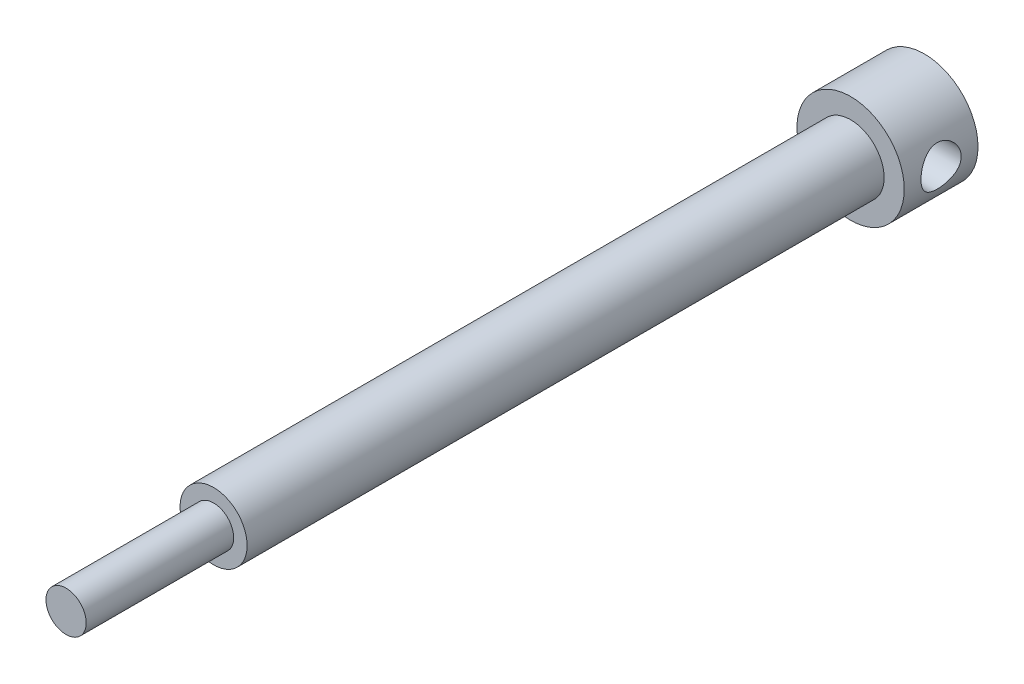
ISO-10303-21;
HEADER;
FILE_DESCRIPTION(('STEP AP214'),'2;1');
FILE_NAME('part.step','',(''),(''),'','','');
FILE_SCHEMA(('AUTOMOTIVE_DESIGN { 1 0 10303 214 1 1 1 1 }'));
ENDSEC;
DATA;
#1=APPLICATION_CONTEXT('core data for automotive mechanical design processes');
#2=APPLICATION_PROTOCOL_DEFINITION('international standard','automotive_design',2000,#1);
#3=PRODUCT_CONTEXT('',#1,'mechanical');
#4=PRODUCT('Part','Part','',(#3));
#5=PRODUCT_RELATED_PRODUCT_CATEGORY('part','',(#4));
#6=PRODUCT_DEFINITION_FORMATION('','',#4);
#7=PRODUCT_DEFINITION_CONTEXT('part definition',#1,'design');
#8=PRODUCT_DEFINITION('design','',#6,#7);
#9=PRODUCT_DEFINITION_SHAPE('','',#8);
#10=(LENGTH_UNIT() NAMED_UNIT(*) SI_UNIT(.MILLI.,.METRE.));
#11=(NAMED_UNIT(*) PLANE_ANGLE_UNIT() SI_UNIT($,.RADIAN.));
#12=(NAMED_UNIT(*) SI_UNIT($,.STERADIAN.) SOLID_ANGLE_UNIT());
#13=UNCERTAINTY_MEASURE_WITH_UNIT(LENGTH_MEASURE(1.E-05),#10,'distance_accuracy_value','');
#14=(GEOMETRIC_REPRESENTATION_CONTEXT(3) GLOBAL_UNCERTAINTY_ASSIGNED_CONTEXT((#13)) GLOBAL_UNIT_ASSIGNED_CONTEXT((#10,
#11,#12)) REPRESENTATION_CONTEXT('',''));
#15=CARTESIAN_POINT('',(0.,0.,0.));
#16=DIRECTION('',(0.,0.,1.));
#17=DIRECTION('',(1.,0.,0.));
#18=AXIS2_PLACEMENT_3D('',#15,#16,#17);
#19=CARTESIAN_POINT('',(0.,0.,11.));
#20=DIRECTION('',(0.,0.,-1.));
#21=DIRECTION('',(-1.,0.,0.));
#22=AXIS2_PLACEMENT_3D('',#19,#20,#21);
#23=CYLINDRICAL_SURFACE('',#22,8.);
#24=CARTESIAN_POINT('',(-8.,0.,2.5));
#25=CARTESIAN_POINT('',(-8.00000434912302,0.162470117875706,2.49999419539378));
#26=CARTESIAN_POINT('',(-7.99500758566368,0.324900483563584,2.51323952049677));
#27=CARTESIAN_POINT('',(-7.97557392013855,0.644906904704722,2.56565639053986));
#28=CARTESIAN_POINT('',(-7.96113837787987,0.802483655975232,2.60482420094113));
#29=CARTESIAN_POINT('',(-7.92437664783088,1.10812156998176,2.70750600354352));
#30=CARTESIAN_POINT('',(-7.90206568698877,1.25620044832455,2.77097303364358));
#31=CARTESIAN_POINT('',(-7.85177535530709,1.53959862032051,2.92021282603164));
#32=CARTESIAN_POINT('',(-7.82379446455107,1.67491447835576,3.0059915710883));
#33=CARTESIAN_POINT('',(-7.76372493942421,1.93469283409165,3.20122506214183));
#34=CARTESIAN_POINT('',(-7.73152005167087,2.05854146030237,3.31146052451884));
#35=CARTESIAN_POINT('',(-7.66720441742698,2.28648842948728,3.55082086931765));
#36=CARTESIAN_POINT('',(-7.63509370270232,2.39058072718411,3.67995151217563));
#37=CARTESIAN_POINT('',(-7.5732494123529,2.57996404431964,3.95943493504654));
#38=CARTESIAN_POINT('',(-7.5436529764098,2.66438786391496,4.1104087330921));
#39=CARTESIAN_POINT('',(-7.49199720475523,2.80637292668193,4.42569670833658));
#40=CARTESIAN_POINT('',(-7.46993485954215,2.86394489922567,4.59000552630848));
#41=CARTESIAN_POINT('',(-7.43708825645919,2.94816862035013,4.92023348051806));
#42=CARTESIAN_POINT('',(-7.42587848693063,2.97599186436803,5.08581007687695));
#43=CARTESIAN_POINT('',(-7.41476122931038,3.00359113063608,5.41963231598162));
#44=CARTESIAN_POINT('',(-7.41484907350686,3.00337873606425,5.58787682772633));
#45=CARTESIAN_POINT('',(-7.42595023233986,2.97580859218857,5.91153905045712));
#46=CARTESIAN_POINT('',(-7.43630937632964,2.95007617013711,6.0671218121852));
#47=CARTESIAN_POINT('',(-7.46569876010067,2.87488335732475,6.37157430090249));
#48=CARTESIAN_POINT('',(-7.48473030568195,2.82541939325577,6.520443013249));
#49=CARTESIAN_POINT('',(-7.52971404410467,2.70327497145115,6.81055413542651));
#50=CARTESIAN_POINT('',(-7.55579035984378,2.63017297474552,6.95159897223456));
#51=CARTESIAN_POINT('',(-7.61188420270589,2.46312147525044,7.21989147518999));
#52=CARTESIAN_POINT('',(-7.64190308912093,2.36916477457696,7.34713435504162));
#53=CARTESIAN_POINT('',(-7.70496077720597,2.15563561533201,7.59320732729938));
#54=CARTESIAN_POINT('',(-7.73806694911977,2.03476597433939,7.71089728149555));
#55=CARTESIAN_POINT('',(-7.80183456327535,1.77462518163776,7.92467593241223));
#56=CARTESIAN_POINT('',(-7.83249562931733,1.63535120699465,8.02076130921151));
#57=CARTESIAN_POINT('',(-7.88852789618334,1.33944687398492,8.18986079412487));
#58=CARTESIAN_POINT('',(-7.91380996519278,1.18258142768946,8.26249516244208));
#59=CARTESIAN_POINT('',(-7.95557436653877,0.857673701049146,8.37996520854013));
#60=CARTESIAN_POINT('',(-7.97206060682974,0.689636421691529,8.42481323312225));
#61=CARTESIAN_POINT('',(-7.99368886456142,0.356750486297336,8.48324557508387));
#62=CARTESIAN_POINT('',(-7.99938738051376,0.192207239124421,8.49836521276502));
#63=CARTESIAN_POINT('',(-8.00051787400248,-0.13714495051005,8.50138212779984));
#64=CARTESIAN_POINT('',(-7.99595212773726,-0.301953825966746,8.48928544063356));
#65=CARTESIAN_POINT('',(-7.97743419545287,-0.620524097123718,8.43937991538266));
#66=CARTESIAN_POINT('',(-7.9638494192461,-0.774466656014671,8.40257691252583));
#67=CARTESIAN_POINT('',(-7.92902954183434,-1.07388350991444,8.30562785490536));
#68=CARTESIAN_POINT('',(-7.9077934456406,-1.21935670069507,8.24547876410393));
#69=CARTESIAN_POINT('',(-7.85899248815363,-1.50249553022031,8.10162717512105));
#70=CARTESIAN_POINT('',(-7.83126000418696,-1.63980616711559,8.01728454155323));
#71=CARTESIAN_POINT('',(-7.77253343129328,-1.89878542345325,7.82816379365689));
#72=CARTESIAN_POINT('',(-7.74153814019032,-2.0204482405409,7.7233781349097));
#73=CARTESIAN_POINT('',(-7.67746658981979,-2.25206159748908,7.48919175575145));
#74=CARTESIAN_POINT('',(-7.64437393007459,-2.36092308247137,7.3587156344546));
#75=CARTESIAN_POINT('',(-7.58157631493707,-2.55542100063806,7.08069723058469));
#76=CARTESIAN_POINT('',(-7.55187166388799,-2.64105534829037,6.933153417223));
#77=CARTESIAN_POINT('',(-7.49933659644927,-2.78675547037995,6.62396802645537));
#78=CARTESIAN_POINT('',(-7.47653520656987,-2.84671370893836,6.46227050817913));
#79=CARTESIAN_POINT('',(-7.4410806578201,-2.93815766933778,6.12998047262436));
#80=CARTESIAN_POINT('',(-7.42842122114981,-2.9696610061107,5.95939352760375));
#81=CARTESIAN_POINT('',(-7.41551789585147,-3.00172694195678,5.62596768091777));
#82=CARTESIAN_POINT('',(-7.41452889046682,-3.00414662991675,5.46333473656623));
#83=CARTESIAN_POINT('',(-7.42316825490584,-2.98273431283185,5.14010936744767));
#84=CARTESIAN_POINT('',(-7.43279561797798,-2.95890479700247,4.97951675065683));
#85=CARTESIAN_POINT('',(-7.46096283170865,-2.88711631260483,4.6699055465669));
#86=CARTESIAN_POINT('',(-7.47922170753326,-2.83991596633048,4.52068330750931));
#87=CARTESIAN_POINT('',(-7.52243096595689,-2.72339393559839,4.23218898301116));
#88=CARTESIAN_POINT('',(-7.54738303990429,-2.65406665889889,4.09291942385972));
#89=CARTESIAN_POINT('',(-7.60279447807929,-2.49104151876308,3.82034642060474));
#90=CARTESIAN_POINT('',(-7.63347396881928,-2.3962566560602,3.68773840640018));
#91=CARTESIAN_POINT('',(-7.69612493514355,-2.18668971459812,3.43971687805759));
#92=CARTESIAN_POINT('',(-7.7280968188629,-2.07190128025617,3.3243088504265));
#93=CARTESIAN_POINT('',(-7.79180849219762,-1.81816079356925,3.10759608835632));
#94=CARTESIAN_POINT('',(-7.82344209801289,-1.67823728842599,3.00739249313065));
#95=CARTESIAN_POINT('',(-7.88109028914061,-1.38242644640164,2.83195468944689));
#96=CARTESIAN_POINT('',(-7.90710443703118,-1.22653786818124,2.75672242452726));
#97=CARTESIAN_POINT('',(-7.9514858521336,-0.895998164004625,2.63124634190334));
#98=CARTESIAN_POINT('',(-7.96947314316712,-0.720826844468417,2.58222587079621));
#99=CARTESIAN_POINT('',(-7.99372484359173,-0.363751467212764,2.51661408015864));
#100=CARTESIAN_POINT('',(-7.99999513207934,-0.181850832729718,2.50000649702535));
#101=CARTESIAN_POINT('',(-8.,0.,2.5));
#102=B_SPLINE_CURVE_WITH_KNOTS('',3,(#24,#25,#26,#27,#28,#29,#30,#31,#32,#33,#34,#35,#36,#37,
#38,#39,#40,#41,#42,#43,#44,#45,#46,#47,#48,#49,#50,#51,#52,#53,#54,#55,#56,#57,#58,#59,#60,#61,
#62,#63,#64,#65,#66,#67,#68,#69,#70,#71,#72,#73,#74,#75,#76,#77,#78,#79,#80,#81,#82,#83,#84,#85,
#86,#87,#88,#89,#90,#91,#92,#93,#94,#95,#96,#97,#98,#99,#100,#101),.UNSPECIFIED.,.T.,.F.,(4,2,2,
2,2,2,2,2,2,2,2,2,2,2,2,2,2,2,2,2,2,2,2,2,2,2,2,2,2,2,2,2,2,2,2,2,2,2,4),(0.,0.48673960312112,
0.973409099060921,1.45914273842715,1.94500675921898,2.44947237165431,2.95409209851243,
3.47793349003317,4.00156538704268,4.50371748833803,5.00566212159414,5.47756690242935,
5.94954276126852,6.43044816779711,6.91151981494191,7.42492306677299,7.93840515815806,
8.45982750577824,8.98101799403365,9.47450039277525,9.96787336786715,10.4422887585335,
10.9167658651458,11.4051844372487,11.8937836004541,12.4107303891699,12.9277235784596,
13.4468613346008,13.9656774991869,14.4511752696618,14.9366270042819,15.4072628485874,
15.8780177331869,16.3734494377422,16.869038839998,17.3914465931375,17.9138949961588,
18.4589703006976,19.0037720359793),.UNSPECIFIED.);
#103=CARTESIAN_POINT('',(-8.,0.,2.5));
#104=VERTEX_POINT('',#103);
#105=EDGE_CURVE('E10',#104,#104,#102,.T.);
#106=ORIENTED_EDGE('',*,*,#105,.T.);
#107=EDGE_LOOP('',(#106));
#108=FACE_BOUND('',#107,.T.);
#109=CARTESIAN_POINT('',(8.,0.,2.5));
#110=CARTESIAN_POINT('',(8.00000434912302,-0.162470117875706,2.49999419539378));
#111=CARTESIAN_POINT('',(7.99500758566368,-0.324900483563584,2.51323952049677));
#112=CARTESIAN_POINT('',(7.97557392013855,-0.644906904704722,2.56565639053986));
#113=CARTESIAN_POINT('',(7.96113837787987,-0.802483655975232,2.60482420094113));
#114=CARTESIAN_POINT('',(7.92437664783088,-1.10812156998176,2.70750600354352));
#115=CARTESIAN_POINT('',(7.90206568698877,-1.25620044832455,2.77097303364358));
#116=CARTESIAN_POINT('',(7.85177535530709,-1.53959862032051,2.92021282603164));
#117=CARTESIAN_POINT('',(7.82379446455107,-1.67491447835576,3.0059915710883));
#118=CARTESIAN_POINT('',(7.76372493942421,-1.93469283409165,3.20122506214183));
#119=CARTESIAN_POINT('',(7.73152005167087,-2.05854146030237,3.31146052451884));
#120=CARTESIAN_POINT('',(7.66720441742698,-2.28648842948728,3.55082086931765));
#121=CARTESIAN_POINT('',(7.63509370270232,-2.39058072718411,3.67995151217563));
#122=CARTESIAN_POINT('',(7.5732494123529,-2.57996404431964,3.95943493504654));
#123=CARTESIAN_POINT('',(7.5436529764098,-2.66438786391496,4.1104087330921));
#124=CARTESIAN_POINT('',(7.49199720475523,-2.80637292668193,4.42569670833658));
#125=CARTESIAN_POINT('',(7.46993485954215,-2.86394489922567,4.59000552630848));
#126=CARTESIAN_POINT('',(7.43708825645919,-2.94816862035013,4.92023348051806));
#127=CARTESIAN_POINT('',(7.42587848693063,-2.97599186436803,5.08581007687695));
#128=CARTESIAN_POINT('',(7.41476122931038,-3.00359113063608,5.41963231598162));
#129=CARTESIAN_POINT('',(7.41484907350686,-3.00337873606425,5.58787682772633));
#130=CARTESIAN_POINT('',(7.42595023233986,-2.97580859218857,5.91153905045712));
#131=CARTESIAN_POINT('',(7.43630937632964,-2.95007617013711,6.0671218121852));
#132=CARTESIAN_POINT('',(7.46569876010067,-2.87488335732475,6.37157430090249));
#133=CARTESIAN_POINT('',(7.48473030568195,-2.82541939325577,6.520443013249));
#134=CARTESIAN_POINT('',(7.52971404410467,-2.70327497145115,6.81055413542651));
#135=CARTESIAN_POINT('',(7.55579035984378,-2.63017297474552,6.95159897223456));
#136=CARTESIAN_POINT('',(7.61188420270589,-2.46312147525044,7.21989147518999));
#137=CARTESIAN_POINT('',(7.64190308912093,-2.36916477457696,7.34713435504162));
#138=CARTESIAN_POINT('',(7.70496077720597,-2.15563561533201,7.59320732729938));
#139=CARTESIAN_POINT('',(7.73806694911977,-2.03476597433939,7.71089728149555));
#140=CARTESIAN_POINT('',(7.80183456327535,-1.77462518163776,7.92467593241223));
#141=CARTESIAN_POINT('',(7.83249562931733,-1.63535120699465,8.02076130921151));
#142=CARTESIAN_POINT('',(7.88852789618334,-1.33944687398492,8.18986079412487));
#143=CARTESIAN_POINT('',(7.91380996519278,-1.18258142768946,8.26249516244208));
#144=CARTESIAN_POINT('',(7.95557436653877,-0.857673701049146,8.37996520854013));
#145=CARTESIAN_POINT('',(7.97206060682974,-0.689636421691529,8.42481323312225));
#146=CARTESIAN_POINT('',(7.99368886456142,-0.356750486297336,8.48324557508387));
#147=CARTESIAN_POINT('',(7.99938738051376,-0.192207239124421,8.49836521276502));
#148=CARTESIAN_POINT('',(8.00051787400248,0.13714495051005,8.50138212779984));
#149=CARTESIAN_POINT('',(7.99595212773726,0.301953825966746,8.48928544063356));
#150=CARTESIAN_POINT('',(7.97743419545287,0.620524097123718,8.43937991538266));
#151=CARTESIAN_POINT('',(7.9638494192461,0.774466656014671,8.40257691252583));
#152=CARTESIAN_POINT('',(7.92902954183434,1.07388350991444,8.30562785490536));
#153=CARTESIAN_POINT('',(7.9077934456406,1.21935670069507,8.24547876410393));
#154=CARTESIAN_POINT('',(7.85899248815363,1.50249553022031,8.10162717512105));
#155=CARTESIAN_POINT('',(7.83126000418696,1.63980616711559,8.01728454155323));
#156=CARTESIAN_POINT('',(7.77253343129328,1.89878542345325,7.82816379365689));
#157=CARTESIAN_POINT('',(7.74153814019032,2.0204482405409,7.7233781349097));
#158=CARTESIAN_POINT('',(7.67746658981979,2.25206159748908,7.48919175575145));
#159=CARTESIAN_POINT('',(7.64437393007459,2.36092308247137,7.3587156344546));
#160=CARTESIAN_POINT('',(7.58157631493707,2.55542100063806,7.08069723058469));
#161=CARTESIAN_POINT('',(7.55187166388799,2.64105534829037,6.933153417223));
#162=CARTESIAN_POINT('',(7.49933659644927,2.78675547037995,6.62396802645537));
#163=CARTESIAN_POINT('',(7.47653520656987,2.84671370893836,6.46227050817913));
#164=CARTESIAN_POINT('',(7.4410806578201,2.93815766933778,6.12998047262436));
#165=CARTESIAN_POINT('',(7.42842122114981,2.9696610061107,5.95939352760375));
#166=CARTESIAN_POINT('',(7.41551789585147,3.00172694195678,5.62596768091777));
#167=CARTESIAN_POINT('',(7.41452889046682,3.00414662991675,5.46333473656623));
#168=CARTESIAN_POINT('',(7.42316825490584,2.98273431283185,5.14010936744767));
#169=CARTESIAN_POINT('',(7.43279561797798,2.95890479700247,4.97951675065683));
#170=CARTESIAN_POINT('',(7.46096283170865,2.88711631260483,4.6699055465669));
#171=CARTESIAN_POINT('',(7.47922170753326,2.83991596633048,4.52068330750931));
#172=CARTESIAN_POINT('',(7.52243096595689,2.72339393559839,4.23218898301116));
#173=CARTESIAN_POINT('',(7.54738303990429,2.65406665889889,4.09291942385972));
#174=CARTESIAN_POINT('',(7.60279447807929,2.49104151876308,3.82034642060474));
#175=CARTESIAN_POINT('',(7.63347396881928,2.3962566560602,3.68773840640018));
#176=CARTESIAN_POINT('',(7.69612493514355,2.18668971459812,3.43971687805759));
#177=CARTESIAN_POINT('',(7.7280968188629,2.07190128025617,3.3243088504265));
#178=CARTESIAN_POINT('',(7.79180849219762,1.81816079356925,3.10759608835632));
#179=CARTESIAN_POINT('',(7.82344209801289,1.67823728842599,3.00739249313065));
#180=CARTESIAN_POINT('',(7.88109028914061,1.38242644640164,2.83195468944689));
#181=CARTESIAN_POINT('',(7.90710443703118,1.22653786818124,2.75672242452726));
#182=CARTESIAN_POINT('',(7.9514858521336,0.895998164004625,2.63124634190334));
#183=CARTESIAN_POINT('',(7.96947314316712,0.720826844468417,2.58222587079621));
#184=CARTESIAN_POINT('',(7.99372484359173,0.363751467212764,2.51661408015864));
#185=CARTESIAN_POINT('',(7.99999513207934,0.181850832729718,2.50000649702535));
#186=CARTESIAN_POINT('',(8.,0.,2.5));
#187=B_SPLINE_CURVE_WITH_KNOTS('',3,(#109,#110,#111,#112,#113,#114,#115,#116,#117,#118,#119,
#120,#121,#122,#123,#124,#125,#126,#127,#128,#129,#130,#131,#132,#133,#134,#135,#136,#137,#138,
#139,#140,#141,#142,#143,#144,#145,#146,#147,#148,#149,#150,#151,#152,#153,#154,#155,#156,#157,
#158,#159,#160,#161,#162,#163,#164,#165,#166,#167,#168,#169,#170,#171,#172,#173,#174,#175,#176,
#177,#178,#179,#180,#181,#182,#183,#184,#185,#186),.UNSPECIFIED.,.T.,.F.,(4,2,2,2,2,2,2,2,2,2,2,
2,2,2,2,2,2,2,2,2,2,2,2,2,2,2,2,2,2,2,2,2,2,2,2,2,2,2,4),(0.,0.48673960312112,0.973409099060921,
1.45914273842715,1.94500675921898,2.44947237165431,2.95409209851243,3.47793349003317,
4.00156538704268,4.50371748833803,5.00566212159414,5.47756690242935,5.94954276126852,
6.43044816779711,6.91151981494191,7.42492306677299,7.93840515815806,8.45982750577824,
8.98101799403365,9.47450039277525,9.96787336786715,10.4422887585335,10.9167658651458,
11.4051844372487,11.8937836004541,12.4107303891699,12.9277235784596,13.4468613346008,
13.9656774991869,14.4511752696618,14.9366270042819,15.4072628485874,15.8780177331869,
16.3734494377422,16.869038839998,17.3914465931375,17.9138949961588,18.4589703006976,
19.0037720359793),.UNSPECIFIED.);
#188=CARTESIAN_POINT('',(8.,0.,2.5));
#189=VERTEX_POINT('',#188);
#190=EDGE_CURVE('E50',#189,#189,#187,.T.);
#191=ORIENTED_EDGE('',*,*,#190,.T.);
#192=EDGE_LOOP('',(#191));
#193=FACE_BOUND('',#192,.T.);
#194=CARTESIAN_POINT('',(0.,0.,11.));
#195=DIRECTION('',(0.,0.,1.));
#196=DIRECTION('',(1.,0.,0.));
#197=AXIS2_PLACEMENT_3D('',#194,#195,#196);
#198=CIRCLE('',#197,8.);
#199=CARTESIAN_POINT('',(8.,0.,11.));
#200=VERTEX_POINT('',#199);
#201=EDGE_CURVE('E104',#200,#200,#198,.T.);
#202=ORIENTED_EDGE('',*,*,#201,.F.);
#203=EDGE_LOOP('',(#202));
#204=FACE_BOUND('',#203,.T.);
#205=CARTESIAN_POINT('',(0.,0.,0.));
#206=DIRECTION('',(0.,0.,1.));
#207=DIRECTION('',(1.,0.,0.));
#208=AXIS2_PLACEMENT_3D('',#205,#206,#207);
#209=CIRCLE('',#208,8.);
#210=CARTESIAN_POINT('',(8.,0.,0.));
#211=VERTEX_POINT('',#210);
#212=EDGE_CURVE('E64',#211,#211,#209,.T.);
#213=ORIENTED_EDGE('',*,*,#212,.T.);
#214=EDGE_LOOP('',(#213));
#215=FACE_BOUND('',#214,.T.);
#216=ADVANCED_FACE('F39',(#108,#193,#204,#215),#23,.T.);
#217=CARTESIAN_POINT('',(0.,0.,11.));
#218=DIRECTION('',(0.,0.,1.));
#219=DIRECTION('',(1.,0.,0.));
#220=AXIS2_PLACEMENT_3D('',#217,#218,#219);
#221=PLANE('',#220);
#222=CARTESIAN_POINT('',(0.,0.,11.));
#223=DIRECTION('',(0.,0.,1.));
#224=DIRECTION('',(1.,0.,0.));
#225=AXIS2_PLACEMENT_3D('',#222,#223,#224);
#226=CIRCLE('',#225,5.);
#227=CARTESIAN_POINT('',(5.,0.,11.));
#228=VERTEX_POINT('',#227);
#229=EDGE_CURVE('E58',#228,#228,#226,.T.);
#230=ORIENTED_EDGE('',*,*,#229,.F.);
#231=EDGE_LOOP('',(#230));
#232=FACE_BOUND('',#231,.T.);
#233=ORIENTED_EDGE('',*,*,#201,.T.);
#234=EDGE_LOOP('',(#233));
#235=FACE_BOUND('',#234,.T.);
#236=ADVANCED_FACE('F89',(#232,#235),#221,.T.);
#237=CARTESIAN_POINT('',(0.,0.,0.));
#238=DIRECTION('',(0.,0.,1.));
#239=DIRECTION('',(1.,0.,0.));
#240=AXIS2_PLACEMENT_3D('',#237,#238,#239);
#241=PLANE('',#240);
#242=ORIENTED_EDGE('',*,*,#212,.F.);
#243=EDGE_LOOP('',(#242));
#244=FACE_BOUND('',#243,.T.);
#245=ADVANCED_FACE('F87',(#244),#241,.F.);
#246=CARTESIAN_POINT('',(0.,0.,106.));
#247=DIRECTION('',(0.,0.,-1.));
#248=DIRECTION('',(-1.,0.,0.));
#249=AXIS2_PLACEMENT_3D('',#246,#247,#248);
#250=CYLINDRICAL_SURFACE('',#249,5.);
#251=CARTESIAN_POINT('',(0.,0.,106.));
#252=DIRECTION('',(0.,0.,1.));
#253=DIRECTION('',(1.,0.,0.));
#254=AXIS2_PLACEMENT_3D('',#251,#252,#253);
#255=CIRCLE('',#254,5.);
#256=CARTESIAN_POINT('',(5.,0.,106.));
#257=VERTEX_POINT('',#256);
#258=EDGE_CURVE('E106',#257,#257,#255,.T.);
#259=ORIENTED_EDGE('',*,*,#258,.F.);
#260=EDGE_LOOP('',(#259));
#261=FACE_BOUND('',#260,.T.);
#262=ORIENTED_EDGE('',*,*,#229,.T.);
#263=EDGE_LOOP('',(#262));
#264=FACE_BOUND('',#263,.T.);
#265=ADVANCED_FACE('F83',(#261,#264),#250,.T.);
#266=CARTESIAN_POINT('',(0.,0.,106.));
#267=DIRECTION('',(0.,0.,1.));
#268=DIRECTION('',(1.,0.,0.));
#269=AXIS2_PLACEMENT_3D('',#266,#267,#268);
#270=PLANE('',#269);
#271=CARTESIAN_POINT('',(0.,0.,106.));
#272=DIRECTION('',(0.,0.,1.));
#273=DIRECTION('',(1.,0.,0.));
#274=AXIS2_PLACEMENT_3D('',#271,#272,#273);
#275=CIRCLE('',#274,3.);
#276=CARTESIAN_POINT('',(3.,0.,106.));
#277=VERTEX_POINT('',#276);
#278=EDGE_CURVE('E54',#277,#277,#275,.T.);
#279=ORIENTED_EDGE('',*,*,#278,.F.);
#280=EDGE_LOOP('',(#279));
#281=FACE_BOUND('',#280,.T.);
#282=ORIENTED_EDGE('',*,*,#258,.T.);
#283=EDGE_LOOP('',(#282));
#284=FACE_BOUND('',#283,.T.);
#285=ADVANCED_FACE('F79',(#281,#284),#270,.T.);
#286=CARTESIAN_POINT('',(0.,0.,128.));
#287=DIRECTION('',(0.,0.,-1.));
#288=DIRECTION('',(-1.,0.,0.));
#289=AXIS2_PLACEMENT_3D('',#286,#287,#288);
#290=CYLINDRICAL_SURFACE('',#289,3.);
#291=CARTESIAN_POINT('',(0.,0.,128.));
#292=DIRECTION('',(0.,0.,1.));
#293=DIRECTION('',(1.,0.,0.));
#294=AXIS2_PLACEMENT_3D('',#291,#292,#293);
#295=CIRCLE('',#294,3.);
#296=CARTESIAN_POINT('',(3.,0.,128.));
#297=VERTEX_POINT('',#296);
#298=EDGE_CURVE('E108',#297,#297,#295,.T.);
#299=ORIENTED_EDGE('',*,*,#298,.F.);
#300=EDGE_LOOP('',(#299));
#301=FACE_BOUND('',#300,.T.);
#302=ORIENTED_EDGE('',*,*,#278,.T.);
#303=EDGE_LOOP('',(#302));
#304=FACE_BOUND('',#303,.T.);
#305=ADVANCED_FACE('F75',(#301,#304),#290,.T.);
#306=CARTESIAN_POINT('',(0.,0.,128.));
#307=DIRECTION('',(0.,0.,1.));
#308=DIRECTION('',(1.,0.,0.));
#309=AXIS2_PLACEMENT_3D('',#306,#307,#308);
#310=PLANE('',#309);
#311=ORIENTED_EDGE('',*,*,#298,.T.);
#312=EDGE_LOOP('',(#311));
#313=FACE_BOUND('',#312,.T.);
#314=ADVANCED_FACE('F70',(#313),#310,.T.);
#315=CARTESIAN_POINT('',(-8.,0.,5.5));
#316=DIRECTION('',(1.,0.,0.));
#317=DIRECTION('',(0.,0.,-1.));
#318=AXIS2_PLACEMENT_3D('',#315,#316,#317);
#319=CYLINDRICAL_SURFACE('',#318,3.);
#320=ORIENTED_EDGE('',*,*,#190,.F.);
#321=EDGE_LOOP('',(#320));
#322=FACE_BOUND('',#321,.T.);
#323=ORIENTED_EDGE('',*,*,#105,.F.);
#324=EDGE_LOOP('',(#323));
#325=FACE_BOUND('',#324,.T.);
#326=ADVANCED_FACE('F66',(#322,#325),#319,.F.);
#327=CLOSED_SHELL('',(#216,#236,#245,#265,#285,#305,#314,#326));
#328=MANIFOLD_SOLID_BREP('B2',#327);
#329=ADVANCED_BREP_SHAPE_REPRESENTATION('',(#18,#328),#14);
#330=SHAPE_DEFINITION_REPRESENTATION(#9,#329);
ENDSEC;
END-ISO-10303-21;
